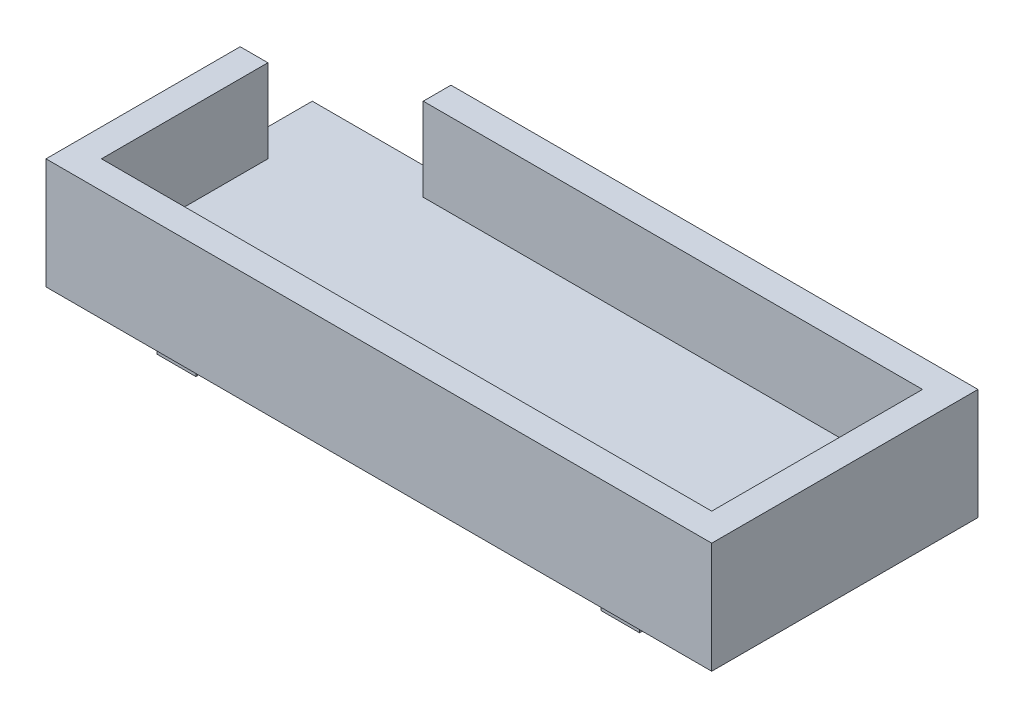
ISO-10303-21;
HEADER;
FILE_DESCRIPTION(('STEP AP214'),'2;1');
FILE_NAME('part.step','',(''),(''),'','','');
FILE_SCHEMA(('AUTOMOTIVE_DESIGN { 1 0 10303 214 1 1 1 1 }'));
ENDSEC;
DATA;
#1=APPLICATION_CONTEXT('core data for automotive mechanical design processes');
#2=APPLICATION_PROTOCOL_DEFINITION('international standard','automotive_design',2000,#1);
#3=PRODUCT_CONTEXT('',#1,'mechanical');
#4=PRODUCT('Part','Part','',(#3));
#5=PRODUCT_RELATED_PRODUCT_CATEGORY('part','',(#4));
#6=PRODUCT_DEFINITION_FORMATION('','',#4);
#7=PRODUCT_DEFINITION_CONTEXT('part definition',#1,'design');
#8=PRODUCT_DEFINITION('design','',#6,#7);
#9=PRODUCT_DEFINITION_SHAPE('','',#8);
#10=(LENGTH_UNIT() NAMED_UNIT(*) SI_UNIT(.MILLI.,.METRE.));
#11=(NAMED_UNIT(*) PLANE_ANGLE_UNIT() SI_UNIT($,.RADIAN.));
#12=(NAMED_UNIT(*) SI_UNIT($,.STERADIAN.) SOLID_ANGLE_UNIT());
#13=UNCERTAINTY_MEASURE_WITH_UNIT(LENGTH_MEASURE(1.E-05),#10,'distance_accuracy_value','');
#14=(GEOMETRIC_REPRESENTATION_CONTEXT(3) GLOBAL_UNCERTAINTY_ASSIGNED_CONTEXT((#13)) GLOBAL_UNIT_ASSIGNED_CONTEXT((#10,
#11,#12)) REPRESENTATION_CONTEXT('',''));
#15=CARTESIAN_POINT('',(0.,0.,0.));
#16=DIRECTION('',(0.,0.,1.));
#17=DIRECTION('',(1.,0.,0.));
#18=AXIS2_PLACEMENT_3D('',#15,#16,#17);
#19=CARTESIAN_POINT('',(0.,0.,0.));
#20=DIRECTION('',(0.,-1.,0.));
#21=DIRECTION('',(0.,0.,-1.));
#22=AXIS2_PLACEMENT_3D('',#19,#20,#21);
#23=PLANE('',#22);
#24=DIRECTION('',(1.,0.,0.));
#25=VECTOR('',#24,1.);
#26=CARTESIAN_POINT('',(0.,0.,-3.49999999999993));
#27=LINE('',#26,#25);
#28=CARTESIAN_POINT('',(16.5,0.,-3.49999999999995));
#29=VERTEX_POINT('',#28);
#30=CARTESIAN_POINT('',(23.5,0.,-3.49999999999996));
#31=VERTEX_POINT('',#30);
#32=EDGE_CURVE('E268',#29,#31,#27,.T.);
#33=ORIENTED_EDGE('',*,*,#32,.T.);
#34=DIRECTION('',(0.,0.,-1.));
#35=VECTOR('',#34,1.);
#36=CARTESIAN_POINT('',(23.5,0.,0.));
#37=LINE('',#36,#35);
#38=CARTESIAN_POINT('',(23.5,0.,-6.99999999999996));
#39=VERTEX_POINT('',#38);
#40=EDGE_CURVE('E284',#31,#39,#37,.T.);
#41=ORIENTED_EDGE('',*,*,#40,.T.);
#42=DIRECTION('',(1.,0.,0.));
#43=VECTOR('',#42,1.);
#44=CARTESIAN_POINT('',(0.,0.,-6.99999999999993));
#45=LINE('',#44,#43);
#46=CARTESIAN_POINT('',(16.5,0.,-6.99999999999995));
#47=VERTEX_POINT('',#46);
#48=EDGE_CURVE('E57',#47,#39,#45,.T.);
#49=ORIENTED_EDGE('',*,*,#48,.F.);
#50=DIRECTION('',(0.,0.,-1.));
#51=VECTOR('',#50,1.);
#52=CARTESIAN_POINT('',(16.5,0.,0.));
#53=LINE('',#52,#51);
#54=EDGE_CURVE('E52',#29,#47,#53,.T.);
#55=ORIENTED_EDGE('',*,*,#54,.F.);
#56=EDGE_LOOP('',(#33,#41,#49,#55));
#57=FACE_BOUND('',#56,.T.);
#58=DIRECTION('',(1.,0.,0.));
#59=VECTOR('',#58,1.);
#60=CARTESIAN_POINT('',(0.,0.,-11.4999999999999));
#61=LINE('',#60,#59);
#62=CARTESIAN_POINT('',(16.5,0.,-11.4999999999999));
#63=VERTEX_POINT('',#62);
#64=CARTESIAN_POINT('',(23.5,0.,-11.5));
#65=VERTEX_POINT('',#64);
#66=EDGE_CURVE('E270',#63,#65,#61,.T.);
#67=ORIENTED_EDGE('',*,*,#66,.T.);
#68=DIRECTION('',(0.,0.,-1.));
#69=VECTOR('',#68,1.);
#70=CARTESIAN_POINT('',(23.5,0.,0.));
#71=LINE('',#70,#69);
#72=CARTESIAN_POINT('',(23.5,0.,-15.));
#73=VERTEX_POINT('',#72);
#74=EDGE_CURVE('E303',#65,#73,#71,.T.);
#75=ORIENTED_EDGE('',*,*,#74,.T.);
#76=DIRECTION('',(1.,0.,0.));
#77=VECTOR('',#76,1.);
#78=CARTESIAN_POINT('',(0.,0.,-14.9999999999999));
#79=LINE('',#78,#77);
#80=CARTESIAN_POINT('',(16.5,0.,-14.9999999999999));
#81=VERTEX_POINT('',#80);
#82=EDGE_CURVE('E315',#81,#73,#79,.T.);
#83=ORIENTED_EDGE('',*,*,#82,.F.);
#84=DIRECTION('',(0.,0.,-1.));
#85=VECTOR('',#84,1.);
#86=CARTESIAN_POINT('',(16.5,0.,0.));
#87=LINE('',#86,#85);
#88=EDGE_CURVE('E312',#63,#81,#87,.T.);
#89=ORIENTED_EDGE('',*,*,#88,.F.);
#90=EDGE_LOOP('',(#67,#75,#83,#89));
#91=FACE_BOUND('',#90,.T.);
#92=DIRECTION('',(1.,0.,0.));
#93=VECTOR('',#92,1.);
#94=CARTESIAN_POINT('',(0.,0.,-19.4999999999999));
#95=LINE('',#94,#93);
#96=CARTESIAN_POINT('',(16.4999999999999,0.,-19.5));
#97=VERTEX_POINT('',#96);
#98=CARTESIAN_POINT('',(23.4999999999999,0.,-19.5));
#99=VERTEX_POINT('',#98);
#100=EDGE_CURVE('E330',#97,#99,#95,.T.);
#101=ORIENTED_EDGE('',*,*,#100,.T.);
#102=DIRECTION('',(0.,0.,-1.));
#103=VECTOR('',#102,1.);
#104=CARTESIAN_POINT('',(23.4999999999999,0.,0.));
#105=LINE('',#104,#103);
#106=CARTESIAN_POINT('',(23.4999999999999,0.,-23.));
#107=VERTEX_POINT('',#106);
#108=EDGE_CURVE('E335',#99,#107,#105,.T.);
#109=ORIENTED_EDGE('',*,*,#108,.T.);
#110=DIRECTION('',(1.,0.,0.));
#111=VECTOR('',#110,1.);
#112=CARTESIAN_POINT('',(0.,0.,-22.9999999999999));
#113=LINE('',#112,#111);
#114=CARTESIAN_POINT('',(16.4999999999999,0.,-23.));
#115=VERTEX_POINT('',#114);
#116=EDGE_CURVE('E347',#115,#107,#113,.T.);
#117=ORIENTED_EDGE('',*,*,#116,.F.);
#118=DIRECTION('',(0.,0.,-1.));
#119=VECTOR('',#118,1.);
#120=CARTESIAN_POINT('',(16.4999999999999,0.,0.));
#121=LINE('',#120,#119);
#122=EDGE_CURVE('E344',#97,#115,#121,.T.);
#123=ORIENTED_EDGE('',*,*,#122,.F.);
#124=EDGE_LOOP('',(#101,#109,#117,#123));
#125=FACE_BOUND('',#124,.T.);
#126=DIRECTION('',(-1.,0.,0.));
#127=VECTOR('',#126,1.);
#128=CARTESIAN_POINT('',(0.,0.,-15.));
#129=LINE('',#128,#127);
#130=CARTESIAN_POINT('',(103.5,0.,-15.));
#131=VERTEX_POINT('',#130);
#132=CARTESIAN_POINT('',(96.5,0.,-15.));
#133=VERTEX_POINT('',#132);
#134=EDGE_CURVE('E395',#131,#133,#129,.T.);
#135=ORIENTED_EDGE('',*,*,#134,.T.);
#136=DIRECTION('',(0.,0.,-1.));
#137=VECTOR('',#136,1.);
#138=CARTESIAN_POINT('',(96.5,0.,0.));
#139=LINE('',#138,#137);
#140=CARTESIAN_POINT('',(96.5,0.,-11.5));
#141=VERTEX_POINT('',#140);
#142=EDGE_CURVE('E400',#141,#133,#139,.T.);
#143=ORIENTED_EDGE('',*,*,#142,.F.);
#144=DIRECTION('',(-1.,0.,0.));
#145=VECTOR('',#144,1.);
#146=CARTESIAN_POINT('',(0.,0.,-11.5));
#147=LINE('',#146,#145);
#148=CARTESIAN_POINT('',(103.5,0.,-11.5));
#149=VERTEX_POINT('',#148);
#150=EDGE_CURVE('E413',#149,#141,#147,.T.);
#151=ORIENTED_EDGE('',*,*,#150,.F.);
#152=DIRECTION('',(0.,0.,-1.));
#153=VECTOR('',#152,1.);
#154=CARTESIAN_POINT('',(103.5,0.,0.));
#155=LINE('',#154,#153);
#156=EDGE_CURVE('E410',#149,#131,#155,.T.);
#157=ORIENTED_EDGE('',*,*,#156,.T.);
#158=EDGE_LOOP('',(#135,#143,#151,#157));
#159=FACE_BOUND('',#158,.T.);
#160=DIRECTION('',(-1.,0.,0.));
#161=VECTOR('',#160,1.);
#162=CARTESIAN_POINT('',(0.,0.,-23.));
#163=LINE('',#162,#161);
#164=CARTESIAN_POINT('',(103.5,0.,-23.));
#165=VERTEX_POINT('',#164);
#166=CARTESIAN_POINT('',(96.5,0.,-23.));
#167=VERTEX_POINT('',#166);
#168=EDGE_CURVE('E425',#165,#167,#163,.T.);
#169=ORIENTED_EDGE('',*,*,#168,.T.);
#170=DIRECTION('',(0.,0.,-1.));
#171=VECTOR('',#170,1.);
#172=CARTESIAN_POINT('',(96.5,0.,0.));
#173=LINE('',#172,#171);
#174=CARTESIAN_POINT('',(96.5,0.,-19.5));
#175=VERTEX_POINT('',#174);
#176=EDGE_CURVE('E430',#175,#167,#173,.T.);
#177=ORIENTED_EDGE('',*,*,#176,.F.);
#178=DIRECTION('',(-1.,0.,0.));
#179=VECTOR('',#178,1.);
#180=CARTESIAN_POINT('',(0.,0.,-19.5));
#181=LINE('',#180,#179);
#182=CARTESIAN_POINT('',(103.5,0.,-19.5));
#183=VERTEX_POINT('',#182);
#184=EDGE_CURVE('E443',#183,#175,#181,.T.);
#185=ORIENTED_EDGE('',*,*,#184,.F.);
#186=DIRECTION('',(0.,0.,-1.));
#187=VECTOR('',#186,1.);
#188=CARTESIAN_POINT('',(103.5,0.,0.));
#189=LINE('',#188,#187);
#190=EDGE_CURVE('E440',#183,#165,#189,.T.);
#191=ORIENTED_EDGE('',*,*,#190,.T.);
#192=EDGE_LOOP('',(#169,#177,#185,#191));
#193=FACE_BOUND('',#192,.T.);
#194=DIRECTION('',(0.,0.,-1.));
#195=VECTOR('',#194,1.);
#196=CARTESIAN_POINT('',(0.,0.,0.));
#197=LINE('',#196,#195);
#198=CARTESIAN_POINT('',(0.,0.,0.));
#199=VERTEX_POINT('',#198);
#200=CARTESIAN_POINT('',(0.,0.,-48.));
#201=VERTEX_POINT('',#200);
#202=EDGE_CURVE('E517',#199,#201,#197,.T.);
#203=ORIENTED_EDGE('',*,*,#202,.T.);
#204=DIRECTION('',(1.,0.,0.));
#205=VECTOR('',#204,1.);
#206=CARTESIAN_POINT('',(0.,0.,-48.));
#207=LINE('',#206,#205);
#208=CARTESIAN_POINT('',(120.,0.,-48.));
#209=VERTEX_POINT('',#208);
#210=EDGE_CURVE('E526',#201,#209,#207,.T.);
#211=ORIENTED_EDGE('',*,*,#210,.T.);
#212=DIRECTION('',(0.,0.,-1.));
#213=VECTOR('',#212,1.);
#214=CARTESIAN_POINT('',(120.,0.,0.));
#215=LINE('',#214,#213);
#216=CARTESIAN_POINT('',(120.,0.,0.));
#217=VERTEX_POINT('',#216);
#218=EDGE_CURVE('E529',#217,#209,#215,.T.);
#219=ORIENTED_EDGE('',*,*,#218,.F.);
#220=DIRECTION('',(1.,0.,0.));
#221=VECTOR('',#220,1.);
#222=CARTESIAN_POINT('',(0.,0.,0.));
#223=LINE('',#222,#221);
#224=EDGE_CURVE('E521',#199,#217,#223,.T.);
#225=ORIENTED_EDGE('',*,*,#224,.F.);
#226=EDGE_LOOP('',(#203,#211,#219,#225));
#227=FACE_BOUND('',#226,.T.);
#228=DIRECTION('',(0.,0.,-1.));
#229=VECTOR('',#228,1.);
#230=CARTESIAN_POINT('',(96.5,0.,0.));
#231=LINE('',#230,#229);
#232=CARTESIAN_POINT('',(96.5,0.,-3.5));
#233=VERTEX_POINT('',#232);
#234=CARTESIAN_POINT('',(96.5,0.,-7.));
#235=VERTEX_POINT('',#234);
#236=EDGE_CURVE('E378',#233,#235,#231,.T.);
#237=ORIENTED_EDGE('',*,*,#236,.F.);
#238=DIRECTION('',(-1.,0.,0.));
#239=VECTOR('',#238,1.);
#240=CARTESIAN_POINT('',(0.,0.,-3.5));
#241=LINE('',#240,#239);
#242=CARTESIAN_POINT('',(103.5,0.,-3.5));
#243=VERTEX_POINT('',#242);
#244=EDGE_CURVE('E362',#243,#233,#241,.T.);
#245=ORIENTED_EDGE('',*,*,#244,.F.);
#246=DIRECTION('',(0.,0.,-1.));
#247=VECTOR('',#246,1.);
#248=CARTESIAN_POINT('',(103.5,0.,0.));
#249=LINE('',#248,#247);
#250=CARTESIAN_POINT('',(103.5,0.,-7.));
#251=VERTEX_POINT('',#250);
#252=EDGE_CURVE('E367',#243,#251,#249,.T.);
#253=ORIENTED_EDGE('',*,*,#252,.T.);
#254=DIRECTION('',(-1.,0.,0.));
#255=VECTOR('',#254,1.);
#256=CARTESIAN_POINT('',(0.,0.,-7.));
#257=LINE('',#256,#255);
#258=EDGE_CURVE('E381',#251,#235,#257,.T.);
#259=ORIENTED_EDGE('',*,*,#258,.T.);
#260=EDGE_LOOP('',(#237,#245,#253,#259));
#261=FACE_BOUND('',#260,.T.);
#262=ADVANCED_FACE('F35',(#57,#91,#125,#159,#193,#227,#261),#23,.T.);
#263=CARTESIAN_POINT('',(0.,5.,0.));
#264=DIRECTION('',(0.,-1.,0.));
#265=DIRECTION('',(0.,0.,-1.));
#266=AXIS2_PLACEMENT_3D('',#263,#264,#265);
#267=PLANE('',#266);
#268=DIRECTION('',(-1.,0.,0.));
#269=VECTOR('',#268,1.);
#270=CARTESIAN_POINT('',(5.,5.,-35.));
#271=LINE('',#270,#269);
#272=CARTESIAN_POINT('',(5.,5.,-35.));
#273=VERTEX_POINT('',#272);
#274=CARTESIAN_POINT('',(0.,5.,-35.));
#275=VERTEX_POINT('',#274);
#276=EDGE_CURVE('E460',#273,#275,#271,.T.);
#277=ORIENTED_EDGE('',*,*,#276,.F.);
#278=DIRECTION('',(0.,0.,-1.));
#279=VECTOR('',#278,1.);
#280=CARTESIAN_POINT('',(5.,5.,-4.99999999999999));
#281=LINE('',#280,#279);
#282=CARTESIAN_POINT('',(5.,5.,-4.99999999999999));
#283=VERTEX_POINT('',#282);
#284=EDGE_CURVE('E492',#283,#273,#281,.T.);
#285=ORIENTED_EDGE('',*,*,#284,.F.);
#286=DIRECTION('',(-1.,0.,0.));
#287=VECTOR('',#286,1.);
#288=CARTESIAN_POINT('',(115.,5.,-5.));
#289=LINE('',#288,#287);
#290=CARTESIAN_POINT('',(115.,5.,-5.));
#291=VERTEX_POINT('',#290);
#292=EDGE_CURVE('E489',#291,#283,#289,.T.);
#293=ORIENTED_EDGE('',*,*,#292,.F.);
#294=DIRECTION('',(0.,0.,1.));
#295=VECTOR('',#294,1.);
#296=CARTESIAN_POINT('',(115.,5.,-43.));
#297=LINE('',#296,#295);
#298=CARTESIAN_POINT('',(115.,5.,-43.));
#299=VERTEX_POINT('',#298);
#300=EDGE_CURVE('E486',#299,#291,#297,.T.);
#301=ORIENTED_EDGE('',*,*,#300,.F.);
#302=DIRECTION('',(1.,0.,0.));
#303=VECTOR('',#302,1.);
#304=CARTESIAN_POINT('',(25.,5.,-43.));
#305=LINE('',#304,#303);
#306=CARTESIAN_POINT('',(25.,5.,-43.));
#307=VERTEX_POINT('',#306);
#308=EDGE_CURVE('E483',#307,#299,#305,.T.);
#309=ORIENTED_EDGE('',*,*,#308,.F.);
#310=DIRECTION('',(0.,0.,1.));
#311=VECTOR('',#310,1.);
#312=CARTESIAN_POINT('',(25.,5.,-48.));
#313=LINE('',#312,#311);
#314=CARTESIAN_POINT('',(25.,5.,-48.));
#315=VERTEX_POINT('',#314);
#316=EDGE_CURVE('E455',#315,#307,#313,.T.);
#317=ORIENTED_EDGE('',*,*,#316,.F.);
#318=DIRECTION('',(1.,0.,0.));
#319=VECTOR('',#318,1.);
#320=CARTESIAN_POINT('',(0.,5.,-48.));
#321=LINE('',#320,#319);
#322=CARTESIAN_POINT('',(0.,5.,-48.));
#323=VERTEX_POINT('',#322);
#324=EDGE_CURVE('E520',#323,#315,#321,.T.);
#325=ORIENTED_EDGE('',*,*,#324,.F.);
#326=DIRECTION('',(0.,0.,-1.));
#327=VECTOR('',#326,1.);
#328=CARTESIAN_POINT('',(0.,5.,0.));
#329=LINE('',#328,#327);
#330=EDGE_CURVE('E518',#275,#323,#329,.T.);
#331=ORIENTED_EDGE('',*,*,#330,.F.);
#332=EDGE_LOOP('',(#277,#285,#293,#301,#309,#317,#325,#331));
#333=FACE_BOUND('',#332,.T.);
#334=ADVANCED_FACE('F563',(#333),#267,.F.);
#335=CARTESIAN_POINT('',(0.,5.,0.));
#336=DIRECTION('',(-1.,0.,0.));
#337=DIRECTION('',(0.,0.,1.));
#338=AXIS2_PLACEMENT_3D('',#335,#336,#337);
#339=PLANE('',#338);
#340=ORIENTED_EDGE('',*,*,#202,.F.);
#341=DIRECTION('',(0.,-1.,0.));
#342=VECTOR('',#341,1.);
#343=CARTESIAN_POINT('',(0.,5.,0.));
#344=LINE('',#343,#342);
#345=CARTESIAN_POINT('',(0.,20.,0.));
#346=VERTEX_POINT('',#345);
#347=EDGE_CURVE('E11',#346,#199,#344,.T.);
#348=ORIENTED_EDGE('',*,*,#347,.F.);
#349=DIRECTION('',(0.,0.,1.));
#350=VECTOR('',#349,1.);
#351=CARTESIAN_POINT('',(0.,20.,-35.));
#352=LINE('',#351,#350);
#353=CARTESIAN_POINT('',(0.,20.,-35.));
#354=VERTEX_POINT('',#353);
#355=EDGE_CURVE('E474',#354,#346,#352,.T.);
#356=ORIENTED_EDGE('',*,*,#355,.F.);
#357=DIRECTION('',(0.,-1.,0.));
#358=VECTOR('',#357,1.);
#359=CARTESIAN_POINT('',(0.,20.,-35.));
#360=LINE('',#359,#358);
#361=EDGE_CURVE('E480',#354,#275,#360,.T.);
#362=ORIENTED_EDGE('',*,*,#361,.T.);
#363=ORIENTED_EDGE('',*,*,#330,.T.);
#364=DIRECTION('',(0.,-1.,0.));
#365=VECTOR('',#364,1.);
#366=CARTESIAN_POINT('',(0.,5.,-48.));
#367=LINE('',#366,#365);
#368=EDGE_CURVE('E39',#323,#201,#367,.T.);
#369=ORIENTED_EDGE('',*,*,#368,.T.);
#370=EDGE_LOOP('',(#340,#348,#356,#362,#363,#369));
#371=FACE_BOUND('',#370,.T.);
#372=ADVANCED_FACE('F37',(#371),#339,.T.);
#373=CARTESIAN_POINT('',(0.,5.,0.));
#374=DIRECTION('',(0.,0.,-1.));
#375=DIRECTION('',(-1.,0.,0.));
#376=AXIS2_PLACEMENT_3D('',#373,#374,#375);
#377=PLANE('',#376);
#378=ORIENTED_EDGE('',*,*,#224,.T.);
#379=DIRECTION('',(0.,-1.,0.));
#380=VECTOR('',#379,1.);
#381=CARTESIAN_POINT('',(120.,5.,0.));
#382=LINE('',#381,#380);
#383=CARTESIAN_POINT('',(120.,20.,0.));
#384=VERTEX_POINT('',#383);
#385=EDGE_CURVE('E44',#384,#217,#382,.T.);
#386=ORIENTED_EDGE('',*,*,#385,.F.);
#387=DIRECTION('',(1.,0.,0.));
#388=VECTOR('',#387,1.);
#389=CARTESIAN_POINT('',(0.,20.,0.));
#390=LINE('',#389,#388);
#391=EDGE_CURVE('E477',#346,#384,#390,.T.);
#392=ORIENTED_EDGE('',*,*,#391,.F.);
#393=ORIENTED_EDGE('',*,*,#347,.T.);
#394=EDGE_LOOP('',(#378,#386,#392,#393));
#395=FACE_BOUND('',#394,.T.);
#396=ADVANCED_FACE('F548',(#395),#377,.F.);
#397=CARTESIAN_POINT('',(120.,5.,0.));
#398=DIRECTION('',(-1.,0.,0.));
#399=DIRECTION('',(0.,0.,1.));
#400=AXIS2_PLACEMENT_3D('',#397,#398,#399);
#401=PLANE('',#400);
#402=ORIENTED_EDGE('',*,*,#218,.T.);
#403=DIRECTION('',(0.,-1.,0.));
#404=VECTOR('',#403,1.);
#405=CARTESIAN_POINT('',(120.,5.,-48.));
#406=LINE('',#405,#404);
#407=CARTESIAN_POINT('',(120.,20.,-48.));
#408=VERTEX_POINT('',#407);
#409=EDGE_CURVE('E534',#408,#209,#406,.T.);
#410=ORIENTED_EDGE('',*,*,#409,.F.);
#411=DIRECTION('',(0.,0.,-1.));
#412=VECTOR('',#411,1.);
#413=CARTESIAN_POINT('',(120.,20.,0.));
#414=LINE('',#413,#412);
#415=EDGE_CURVE('E456',#384,#408,#414,.T.);
#416=ORIENTED_EDGE('',*,*,#415,.F.);
#417=ORIENTED_EDGE('',*,*,#385,.T.);
#418=EDGE_LOOP('',(#402,#410,#416,#417));
#419=FACE_BOUND('',#418,.T.);
#420=ADVANCED_FACE('F552',(#419),#401,.F.);
#421=CARTESIAN_POINT('',(0.,5.,-48.));
#422=DIRECTION('',(0.,0.,-1.));
#423=DIRECTION('',(-1.,0.,0.));
#424=AXIS2_PLACEMENT_3D('',#421,#422,#423);
#425=PLANE('',#424);
#426=ORIENTED_EDGE('',*,*,#210,.F.);
#427=ORIENTED_EDGE('',*,*,#368,.F.);
#428=ORIENTED_EDGE('',*,*,#324,.T.);
#429=DIRECTION('',(0.,-1.,0.));
#430=VECTOR('',#429,1.);
#431=CARTESIAN_POINT('',(25.,20.,-48.));
#432=LINE('',#431,#430);
#433=CARTESIAN_POINT('',(25.,20.,-48.));
#434=VERTEX_POINT('',#433);
#435=EDGE_CURVE('E514',#434,#315,#432,.T.);
#436=ORIENTED_EDGE('',*,*,#435,.F.);
#437=DIRECTION('',(-1.,0.,0.));
#438=VECTOR('',#437,1.);
#439=CARTESIAN_POINT('',(120.,20.,-48.));
#440=LINE('',#439,#438);
#441=EDGE_CURVE('E459',#408,#434,#440,.T.);
#442=ORIENTED_EDGE('',*,*,#441,.F.);
#443=ORIENTED_EDGE('',*,*,#409,.T.);
#444=EDGE_LOOP('',(#426,#427,#428,#436,#442,#443));
#445=FACE_BOUND('',#444,.T.);
#446=ADVANCED_FACE('F542',(#445),#425,.T.);
#447=CARTESIAN_POINT('',(25.,20.,-48.));
#448=DIRECTION('',(1.,0.,0.));
#449=DIRECTION('',(0.,0.,-1.));
#450=AXIS2_PLACEMENT_3D('',#447,#448,#449);
#451=PLANE('',#450);
#452=ORIENTED_EDGE('',*,*,#316,.T.);
#453=DIRECTION('',(0.,-1.,0.));
#454=VECTOR('',#453,1.);
#455=CARTESIAN_POINT('',(25.,20.,-43.));
#456=LINE('',#455,#454);
#457=CARTESIAN_POINT('',(25.,20.,-43.));
#458=VERTEX_POINT('',#457);
#459=EDGE_CURVE('E511',#458,#307,#456,.T.);
#460=ORIENTED_EDGE('',*,*,#459,.F.);
#461=DIRECTION('',(0.,0.,1.));
#462=VECTOR('',#461,1.);
#463=CARTESIAN_POINT('',(25.,20.,-48.));
#464=LINE('',#463,#462);
#465=EDGE_CURVE('E462',#434,#458,#464,.T.);
#466=ORIENTED_EDGE('',*,*,#465,.F.);
#467=ORIENTED_EDGE('',*,*,#435,.T.);
#468=EDGE_LOOP('',(#452,#460,#466,#467));
#469=FACE_BOUND('',#468,.T.);
#470=ADVANCED_FACE('F581',(#469),#451,.F.);
#471=CARTESIAN_POINT('',(25.,20.,-43.));
#472=DIRECTION('',(0.,0.,-1.));
#473=DIRECTION('',(-1.,0.,0.));
#474=AXIS2_PLACEMENT_3D('',#471,#472,#473);
#475=PLANE('',#474);
#476=ORIENTED_EDGE('',*,*,#308,.T.);
#477=DIRECTION('',(0.,-1.,0.));
#478=VECTOR('',#477,1.);
#479=CARTESIAN_POINT('',(115.,20.,-43.));
#480=LINE('',#479,#478);
#481=CARTESIAN_POINT('',(115.,20.,-43.));
#482=VERTEX_POINT('',#481);
#483=EDGE_CURVE('E508',#482,#299,#480,.T.);
#484=ORIENTED_EDGE('',*,*,#483,.F.);
#485=DIRECTION('',(1.,0.,0.));
#486=VECTOR('',#485,1.);
#487=CARTESIAN_POINT('',(25.,20.,-43.));
#488=LINE('',#487,#486);
#489=EDGE_CURVE('E464',#458,#482,#488,.T.);
#490=ORIENTED_EDGE('',*,*,#489,.F.);
#491=ORIENTED_EDGE('',*,*,#459,.T.);
#492=EDGE_LOOP('',(#476,#484,#490,#491));
#493=FACE_BOUND('',#492,.T.);
#494=ADVANCED_FACE('F578',(#493),#475,.F.);
#495=CARTESIAN_POINT('',(115.,20.,-43.));
#496=DIRECTION('',(1.,0.,0.));
#497=DIRECTION('',(0.,0.,-1.));
#498=AXIS2_PLACEMENT_3D('',#495,#496,#497);
#499=PLANE('',#498);
#500=ORIENTED_EDGE('',*,*,#300,.T.);
#501=DIRECTION('',(0.,-1.,0.));
#502=VECTOR('',#501,1.);
#503=CARTESIAN_POINT('',(115.,20.,-5.));
#504=LINE('',#503,#502);
#505=CARTESIAN_POINT('',(115.,20.,-5.));
#506=VERTEX_POINT('',#505);
#507=EDGE_CURVE('E505',#506,#291,#504,.T.);
#508=ORIENTED_EDGE('',*,*,#507,.F.);
#509=DIRECTION('',(0.,0.,1.));
#510=VECTOR('',#509,1.);
#511=CARTESIAN_POINT('',(115.,20.,-43.));
#512=LINE('',#511,#510);
#513=EDGE_CURVE('E466',#482,#506,#512,.T.);
#514=ORIENTED_EDGE('',*,*,#513,.F.);
#515=ORIENTED_EDGE('',*,*,#483,.T.);
#516=EDGE_LOOP('',(#500,#508,#514,#515));
#517=FACE_BOUND('',#516,.T.);
#518=ADVANCED_FACE('F573',(#517),#499,.F.);
#519=CARTESIAN_POINT('',(115.,20.,-5.));
#520=DIRECTION('',(0.,0.,1.));
#521=DIRECTION('',(1.,0.,0.));
#522=AXIS2_PLACEMENT_3D('',#519,#520,#521);
#523=PLANE('',#522);
#524=ORIENTED_EDGE('',*,*,#292,.T.);
#525=DIRECTION('',(0.,-1.,0.));
#526=VECTOR('',#525,1.);
#527=CARTESIAN_POINT('',(5.,20.,-4.99999999999999));
#528=LINE('',#527,#526);
#529=CARTESIAN_POINT('',(5.,20.,-4.99999999999999));
#530=VERTEX_POINT('',#529);
#531=EDGE_CURVE('E502',#530,#283,#528,.T.);
#532=ORIENTED_EDGE('',*,*,#531,.F.);
#533=DIRECTION('',(-1.,0.,0.));
#534=VECTOR('',#533,1.);
#535=CARTESIAN_POINT('',(115.,20.,-5.));
#536=LINE('',#535,#534);
#537=EDGE_CURVE('E468',#506,#530,#536,.T.);
#538=ORIENTED_EDGE('',*,*,#537,.F.);
#539=ORIENTED_EDGE('',*,*,#507,.T.);
#540=EDGE_LOOP('',(#524,#532,#538,#539));
#541=FACE_BOUND('',#540,.T.);
#542=ADVANCED_FACE('F570',(#541),#523,.F.);
#543=CARTESIAN_POINT('',(5.,20.,-4.99999999999999));
#544=DIRECTION('',(-1.,0.,0.));
#545=DIRECTION('',(0.,0.,1.));
#546=AXIS2_PLACEMENT_3D('',#543,#544,#545);
#547=PLANE('',#546);
#548=ORIENTED_EDGE('',*,*,#284,.T.);
#549=DIRECTION('',(0.,-1.,0.));
#550=VECTOR('',#549,1.);
#551=CARTESIAN_POINT('',(5.,20.,-35.));
#552=LINE('',#551,#550);
#553=CARTESIAN_POINT('',(5.,20.,-35.));
#554=VERTEX_POINT('',#553);
#555=EDGE_CURVE('E499',#554,#273,#552,.T.);
#556=ORIENTED_EDGE('',*,*,#555,.F.);
#557=DIRECTION('',(0.,0.,-1.));
#558=VECTOR('',#557,1.);
#559=CARTESIAN_POINT('',(5.,20.,-4.99999999999999));
#560=LINE('',#559,#558);
#561=EDGE_CURVE('E470',#530,#554,#560,.T.);
#562=ORIENTED_EDGE('',*,*,#561,.F.);
#563=ORIENTED_EDGE('',*,*,#531,.T.);
#564=EDGE_LOOP('',(#548,#556,#562,#563));
#565=FACE_BOUND('',#564,.T.);
#566=ADVANCED_FACE('F565',(#565),#547,.F.);
#567=CARTESIAN_POINT('',(5.,20.,-35.));
#568=DIRECTION('',(0.,0.,1.));
#569=DIRECTION('',(1.,0.,0.));
#570=AXIS2_PLACEMENT_3D('',#567,#568,#569);
#571=PLANE('',#570);
#572=ORIENTED_EDGE('',*,*,#276,.T.);
#573=ORIENTED_EDGE('',*,*,#361,.F.);
#574=DIRECTION('',(-1.,0.,0.));
#575=VECTOR('',#574,1.);
#576=CARTESIAN_POINT('',(5.,20.,-35.));
#577=LINE('',#576,#575);
#578=EDGE_CURVE('E472',#554,#354,#577,.T.);
#579=ORIENTED_EDGE('',*,*,#578,.F.);
#580=ORIENTED_EDGE('',*,*,#555,.T.);
#581=EDGE_LOOP('',(#572,#573,#579,#580));
#582=FACE_BOUND('',#581,.T.);
#583=ADVANCED_FACE('F560',(#582),#571,.F.);
#584=CARTESIAN_POINT('',(0.,20.,0.));
#585=DIRECTION('',(0.,1.,0.));
#586=DIRECTION('',(0.,0.,1.));
#587=AXIS2_PLACEMENT_3D('',#584,#585,#586);
#588=PLANE('',#587);
#589=ORIENTED_EDGE('',*,*,#415,.T.);
#590=ORIENTED_EDGE('',*,*,#441,.T.);
#591=ORIENTED_EDGE('',*,*,#465,.T.);
#592=ORIENTED_EDGE('',*,*,#489,.T.);
#593=ORIENTED_EDGE('',*,*,#513,.T.);
#594=ORIENTED_EDGE('',*,*,#537,.T.);
#595=ORIENTED_EDGE('',*,*,#561,.T.);
#596=ORIENTED_EDGE('',*,*,#578,.T.);
#597=ORIENTED_EDGE('',*,*,#355,.T.);
#598=ORIENTED_EDGE('',*,*,#391,.T.);
#599=EDGE_LOOP('',(#589,#590,#591,#592,#593,#594,#595,#596,#597,#598));
#600=FACE_BOUND('',#599,.T.);
#601=ADVANCED_FACE('F554',(#600),#588,.T.);
#602=CARTESIAN_POINT('',(0.,-4.,-23.));
#603=DIRECTION('',(0.,0.,-1.));
#604=DIRECTION('',(-1.,0.,0.));
#605=AXIS2_PLACEMENT_3D('',#602,#603,#604);
#606=PLANE('',#605);
#607=ORIENTED_EDGE('',*,*,#168,.F.);
#608=DIRECTION('',(0.,1.,0.));
#609=VECTOR('',#608,1.);
#610=CARTESIAN_POINT('',(103.5,-4.,-23.));
#611=LINE('',#610,#609);
#612=CARTESIAN_POINT('',(103.5,-4.,-23.));
#613=VERTEX_POINT('',#612);
#614=EDGE_CURVE('E453',#613,#165,#611,.T.);
#615=ORIENTED_EDGE('',*,*,#614,.F.);
#616=DIRECTION('',(-1.,0.,0.));
#617=VECTOR('',#616,1.);
#618=CARTESIAN_POINT('',(0.,-4.,-23.));
#619=LINE('',#618,#617);
#620=CARTESIAN_POINT('',(96.5,-4.,-23.));
#621=VERTEX_POINT('',#620);
#622=EDGE_CURVE('E426',#613,#621,#619,.T.);
#623=ORIENTED_EDGE('',*,*,#622,.T.);
#624=DIRECTION('',(0.,1.,0.));
#625=VECTOR('',#624,1.);
#626=CARTESIAN_POINT('',(96.5,-4.,-23.));
#627=LINE('',#626,#625);
#628=EDGE_CURVE('E437',#621,#167,#627,.T.);
#629=ORIENTED_EDGE('',*,*,#628,.T.);
#630=EDGE_LOOP('',(#607,#615,#623,#629));
#631=FACE_BOUND('',#630,.T.);
#632=ADVANCED_FACE('F661',(#631),#606,.T.);
#633=CARTESIAN_POINT('',(103.5,-4.,0.));
#634=DIRECTION('',(1.,0.,0.));
#635=DIRECTION('',(0.,0.,-1.));
#636=AXIS2_PLACEMENT_3D('',#633,#634,#635);
#637=PLANE('',#636);
#638=ORIENTED_EDGE('',*,*,#190,.F.);
#639=DIRECTION('',(0.,1.,0.));
#640=VECTOR('',#639,1.);
#641=CARTESIAN_POINT('',(103.5,-4.,-19.5));
#642=LINE('',#641,#640);
#643=CARTESIAN_POINT('',(103.5,-4.,-19.5));
#644=VERTEX_POINT('',#643);
#645=EDGE_CURVE('E451',#644,#183,#642,.T.);
#646=ORIENTED_EDGE('',*,*,#645,.F.);
#647=DIRECTION('',(0.,0.,-1.));
#648=VECTOR('',#647,1.);
#649=CARTESIAN_POINT('',(103.5,-4.,0.));
#650=LINE('',#649,#648);
#651=EDGE_CURVE('E429',#644,#613,#650,.T.);
#652=ORIENTED_EDGE('',*,*,#651,.T.);
#653=ORIENTED_EDGE('',*,*,#614,.T.);
#654=EDGE_LOOP('',(#638,#646,#652,#653));
#655=FACE_BOUND('',#654,.T.);
#656=ADVANCED_FACE('F675',(#655),#637,.T.);
#657=CARTESIAN_POINT('',(0.,-4.,-19.5));
#658=DIRECTION('',(0.,0.,-1.));
#659=DIRECTION('',(-1.,0.,0.));
#660=AXIS2_PLACEMENT_3D('',#657,#658,#659);
#661=PLANE('',#660);
#662=ORIENTED_EDGE('',*,*,#184,.T.);
#663=DIRECTION('',(0.,1.,0.));
#664=VECTOR('',#663,1.);
#665=CARTESIAN_POINT('',(96.5,-4.,-19.5));
#666=LINE('',#665,#664);
#667=CARTESIAN_POINT('',(96.5,-4.,-19.5));
#668=VERTEX_POINT('',#667);
#669=EDGE_CURVE('E449',#668,#175,#666,.T.);
#670=ORIENTED_EDGE('',*,*,#669,.F.);
#671=DIRECTION('',(-1.,0.,0.));
#672=VECTOR('',#671,1.);
#673=CARTESIAN_POINT('',(0.,-4.,-19.5));
#674=LINE('',#673,#672);
#675=EDGE_CURVE('E433',#644,#668,#674,.T.);
#676=ORIENTED_EDGE('',*,*,#675,.F.);
#677=ORIENTED_EDGE('',*,*,#645,.T.);
#678=EDGE_LOOP('',(#662,#670,#676,#677));
#679=FACE_BOUND('',#678,.T.);
#680=ADVANCED_FACE('F685',(#679),#661,.F.);
#681=CARTESIAN_POINT('',(96.5,-4.,0.));
#682=DIRECTION('',(1.,0.,0.));
#683=DIRECTION('',(0.,0.,-1.));
#684=AXIS2_PLACEMENT_3D('',#681,#682,#683);
#685=PLANE('',#684);
#686=ORIENTED_EDGE('',*,*,#176,.T.);
#687=ORIENTED_EDGE('',*,*,#628,.F.);
#688=DIRECTION('',(0.,0.,-1.));
#689=VECTOR('',#688,1.);
#690=CARTESIAN_POINT('',(96.5,-4.,0.));
#691=LINE('',#690,#689);
#692=EDGE_CURVE('E435',#668,#621,#691,.T.);
#693=ORIENTED_EDGE('',*,*,#692,.F.);
#694=ORIENTED_EDGE('',*,*,#669,.T.);
#695=EDGE_LOOP('',(#686,#687,#693,#694));
#696=FACE_BOUND('',#695,.T.);
#697=ADVANCED_FACE('F695',(#696),#685,.F.);
#698=CARTESIAN_POINT('',(0.,-4.,0.));
#699=DIRECTION('',(0.,-1.,0.));
#700=DIRECTION('',(0.,0.,-1.));
#701=AXIS2_PLACEMENT_3D('',#698,#699,#700);
#702=PLANE('',#701);
#703=ORIENTED_EDGE('',*,*,#622,.F.);
#704=ORIENTED_EDGE('',*,*,#651,.F.);
#705=ORIENTED_EDGE('',*,*,#675,.T.);
#706=ORIENTED_EDGE('',*,*,#692,.T.);
#707=EDGE_LOOP('',(#703,#704,#705,#706));
#708=FACE_BOUND('',#707,.T.);
#709=ADVANCED_FACE('F705',(#708),#702,.T.);
#710=CARTESIAN_POINT('',(0.,-4.,-15.));
#711=DIRECTION('',(0.,0.,-1.));
#712=DIRECTION('',(-1.,0.,0.));
#713=AXIS2_PLACEMENT_3D('',#710,#711,#712);
#714=PLANE('',#713);
#715=ORIENTED_EDGE('',*,*,#134,.F.);
#716=DIRECTION('',(0.,1.,0.));
#717=VECTOR('',#716,1.);
#718=CARTESIAN_POINT('',(103.5,-4.,-15.));
#719=LINE('',#718,#717);
#720=CARTESIAN_POINT('',(103.5,-4.,-15.));
#721=VERTEX_POINT('',#720);
#722=EDGE_CURVE('E423',#721,#131,#719,.T.);
#723=ORIENTED_EDGE('',*,*,#722,.F.);
#724=DIRECTION('',(-1.,0.,0.));
#725=VECTOR('',#724,1.);
#726=CARTESIAN_POINT('',(0.,-4.,-15.));
#727=LINE('',#726,#725);
#728=CARTESIAN_POINT('',(96.5,-4.,-15.));
#729=VERTEX_POINT('',#728);
#730=EDGE_CURVE('E396',#721,#729,#727,.T.);
#731=ORIENTED_EDGE('',*,*,#730,.T.);
#732=DIRECTION('',(0.,1.,0.));
#733=VECTOR('',#732,1.);
#734=CARTESIAN_POINT('',(96.5,-4.,-15.));
#735=LINE('',#734,#733);
#736=EDGE_CURVE('E407',#729,#133,#735,.T.);
#737=ORIENTED_EDGE('',*,*,#736,.T.);
#738=EDGE_LOOP('',(#715,#723,#731,#737));
#739=FACE_BOUND('',#738,.T.);
#740=ADVANCED_FACE('F715',(#739),#714,.T.);
#741=CARTESIAN_POINT('',(103.5,-4.,0.));
#742=DIRECTION('',(1.,0.,0.));
#743=DIRECTION('',(0.,0.,-1.));
#744=AXIS2_PLACEMENT_3D('',#741,#742,#743);
#745=PLANE('',#744);
#746=ORIENTED_EDGE('',*,*,#156,.F.);
#747=DIRECTION('',(0.,1.,0.));
#748=VECTOR('',#747,1.);
#749=CARTESIAN_POINT('',(103.5,-4.,-11.5));
#750=LINE('',#749,#748);
#751=CARTESIAN_POINT('',(103.5,-4.,-11.5));
#752=VERTEX_POINT('',#751);
#753=EDGE_CURVE('E421',#752,#149,#750,.T.);
#754=ORIENTED_EDGE('',*,*,#753,.F.);
#755=DIRECTION('',(0.,0.,-1.));
#756=VECTOR('',#755,1.);
#757=CARTESIAN_POINT('',(103.5,-4.,0.));
#758=LINE('',#757,#756);
#759=EDGE_CURVE('E399',#752,#721,#758,.T.);
#760=ORIENTED_EDGE('',*,*,#759,.T.);
#761=ORIENTED_EDGE('',*,*,#722,.T.);
#762=EDGE_LOOP('',(#746,#754,#760,#761));
#763=FACE_BOUND('',#762,.T.);
#764=ADVANCED_FACE('F725',(#763),#745,.T.);
#765=CARTESIAN_POINT('',(0.,-4.,-11.5));
#766=DIRECTION('',(0.,0.,-1.));
#767=DIRECTION('',(-1.,0.,0.));
#768=AXIS2_PLACEMENT_3D('',#765,#766,#767);
#769=PLANE('',#768);
#770=ORIENTED_EDGE('',*,*,#150,.T.);
#771=DIRECTION('',(0.,1.,0.));
#772=VECTOR('',#771,1.);
#773=CARTESIAN_POINT('',(96.5,-4.,-11.5));
#774=LINE('',#773,#772);
#775=CARTESIAN_POINT('',(96.5,-4.,-11.5));
#776=VERTEX_POINT('',#775);
#777=EDGE_CURVE('E419',#776,#141,#774,.T.);
#778=ORIENTED_EDGE('',*,*,#777,.F.);
#779=DIRECTION('',(-1.,0.,0.));
#780=VECTOR('',#779,1.);
#781=CARTESIAN_POINT('',(0.,-4.,-11.5));
#782=LINE('',#781,#780);
#783=EDGE_CURVE('E403',#752,#776,#782,.T.);
#784=ORIENTED_EDGE('',*,*,#783,.F.);
#785=ORIENTED_EDGE('',*,*,#753,.T.);
#786=EDGE_LOOP('',(#770,#778,#784,#785));
#787=FACE_BOUND('',#786,.T.);
#788=ADVANCED_FACE('F735',(#787),#769,.F.);
#789=CARTESIAN_POINT('',(96.5,-4.,0.));
#790=DIRECTION('',(1.,0.,0.));
#791=DIRECTION('',(0.,0.,-1.));
#792=AXIS2_PLACEMENT_3D('',#789,#790,#791);
#793=PLANE('',#792);
#794=ORIENTED_EDGE('',*,*,#142,.T.);
#795=ORIENTED_EDGE('',*,*,#736,.F.);
#796=DIRECTION('',(0.,0.,-1.));
#797=VECTOR('',#796,1.);
#798=CARTESIAN_POINT('',(96.5,-4.,0.));
#799=LINE('',#798,#797);
#800=EDGE_CURVE('E405',#776,#729,#799,.T.);
#801=ORIENTED_EDGE('',*,*,#800,.F.);
#802=ORIENTED_EDGE('',*,*,#777,.T.);
#803=EDGE_LOOP('',(#794,#795,#801,#802));
#804=FACE_BOUND('',#803,.T.);
#805=ADVANCED_FACE('F745',(#804),#793,.F.);
#806=CARTESIAN_POINT('',(0.,-4.,0.));
#807=DIRECTION('',(0.,-1.,0.));
#808=DIRECTION('',(0.,0.,-1.));
#809=AXIS2_PLACEMENT_3D('',#806,#807,#808);
#810=PLANE('',#809);
#811=ORIENTED_EDGE('',*,*,#730,.F.);
#812=ORIENTED_EDGE('',*,*,#759,.F.);
#813=ORIENTED_EDGE('',*,*,#783,.T.);
#814=ORIENTED_EDGE('',*,*,#800,.T.);
#815=EDGE_LOOP('',(#811,#812,#813,#814));
#816=FACE_BOUND('',#815,.T.);
#817=ADVANCED_FACE('F755',(#816),#810,.T.);
#818=CARTESIAN_POINT('',(0.,-4.,-3.5));
#819=DIRECTION('',(0.,0.,-1.));
#820=DIRECTION('',(-1.,0.,0.));
#821=AXIS2_PLACEMENT_3D('',#818,#819,#820);
#822=PLANE('',#821);
#823=ORIENTED_EDGE('',*,*,#244,.T.);
#824=DIRECTION('',(0.,1.,0.));
#825=VECTOR('',#824,1.);
#826=CARTESIAN_POINT('',(96.5,-4.,-3.5));
#827=LINE('',#826,#825);
#828=CARTESIAN_POINT('',(96.5,-4.,-3.5));
#829=VERTEX_POINT('',#828);
#830=EDGE_CURVE('E392',#829,#233,#827,.T.);
#831=ORIENTED_EDGE('',*,*,#830,.F.);
#832=DIRECTION('',(-1.,0.,0.));
#833=VECTOR('',#832,1.);
#834=CARTESIAN_POINT('',(0.,-4.,-3.5));
#835=LINE('',#834,#833);
#836=CARTESIAN_POINT('',(103.5,-4.,-3.5));
#837=VERTEX_POINT('',#836);
#838=EDGE_CURVE('E363',#837,#829,#835,.T.);
#839=ORIENTED_EDGE('',*,*,#838,.F.);
#840=DIRECTION('',(0.,1.,0.));
#841=VECTOR('',#840,1.);
#842=CARTESIAN_POINT('',(103.5,-4.,-3.5));
#843=LINE('',#842,#841);
#844=EDGE_CURVE('E375',#837,#243,#843,.T.);
#845=ORIENTED_EDGE('',*,*,#844,.T.);
#846=EDGE_LOOP('',(#823,#831,#839,#845));
#847=FACE_BOUND('',#846,.T.);
#848=ADVANCED_FACE('F765',(#847),#822,.F.);
#849=CARTESIAN_POINT('',(96.5,-4.,0.));
#850=DIRECTION('',(1.,0.,0.));
#851=DIRECTION('',(0.,0.,-1.));
#852=AXIS2_PLACEMENT_3D('',#849,#850,#851);
#853=PLANE('',#852);
#854=ORIENTED_EDGE('',*,*,#236,.T.);
#855=DIRECTION('',(0.,1.,0.));
#856=VECTOR('',#855,1.);
#857=CARTESIAN_POINT('',(96.5,-4.,-7.));
#858=LINE('',#857,#856);
#859=CARTESIAN_POINT('',(96.5,-4.,-7.));
#860=VERTEX_POINT('',#859);
#861=EDGE_CURVE('E389',#860,#235,#858,.T.);
#862=ORIENTED_EDGE('',*,*,#861,.F.);
#863=DIRECTION('',(0.,0.,-1.));
#864=VECTOR('',#863,1.);
#865=CARTESIAN_POINT('',(96.5,-4.,0.));
#866=LINE('',#865,#864);
#867=EDGE_CURVE('E366',#829,#860,#866,.T.);
#868=ORIENTED_EDGE('',*,*,#867,.F.);
#869=ORIENTED_EDGE('',*,*,#830,.T.);
#870=EDGE_LOOP('',(#854,#862,#868,#869));
#871=FACE_BOUND('',#870,.T.);
#872=ADVANCED_FACE('F775',(#871),#853,.F.);
#873=CARTESIAN_POINT('',(0.,-4.,-7.));
#874=DIRECTION('',(0.,0.,-1.));
#875=DIRECTION('',(-1.,0.,0.));
#876=AXIS2_PLACEMENT_3D('',#873,#874,#875);
#877=PLANE('',#876);
#878=ORIENTED_EDGE('',*,*,#258,.F.);
#879=DIRECTION('',(0.,1.,0.));
#880=VECTOR('',#879,1.);
#881=CARTESIAN_POINT('',(103.5,-4.,-7.));
#882=LINE('',#881,#880);
#883=CARTESIAN_POINT('',(103.5,-4.,-7.));
#884=VERTEX_POINT('',#883);
#885=EDGE_CURVE('E386',#884,#251,#882,.T.);
#886=ORIENTED_EDGE('',*,*,#885,.F.);
#887=DIRECTION('',(-1.,0.,0.));
#888=VECTOR('',#887,1.);
#889=CARTESIAN_POINT('',(0.,-4.,-7.));
#890=LINE('',#889,#888);
#891=EDGE_CURVE('E369',#884,#860,#890,.T.);
#892=ORIENTED_EDGE('',*,*,#891,.T.);
#893=ORIENTED_EDGE('',*,*,#861,.T.);
#894=EDGE_LOOP('',(#878,#886,#892,#893));
#895=FACE_BOUND('',#894,.T.);
#896=ADVANCED_FACE('F785',(#895),#877,.T.);
#897=CARTESIAN_POINT('',(103.5,-4.,0.));
#898=DIRECTION('',(1.,0.,0.));
#899=DIRECTION('',(0.,0.,-1.));
#900=AXIS2_PLACEMENT_3D('',#897,#898,#899);
#901=PLANE('',#900);
#902=ORIENTED_EDGE('',*,*,#252,.F.);
#903=ORIENTED_EDGE('',*,*,#844,.F.);
#904=DIRECTION('',(0.,0.,-1.));
#905=VECTOR('',#904,1.);
#906=CARTESIAN_POINT('',(103.5,-4.,0.));
#907=LINE('',#906,#905);
#908=EDGE_CURVE('E372',#837,#884,#907,.T.);
#909=ORIENTED_EDGE('',*,*,#908,.T.);
#910=ORIENTED_EDGE('',*,*,#885,.T.);
#911=EDGE_LOOP('',(#902,#903,#909,#910));
#912=FACE_BOUND('',#911,.T.);
#913=ADVANCED_FACE('F795',(#912),#901,.T.);
#914=CARTESIAN_POINT('',(0.,-4.,0.));
#915=DIRECTION('',(0.,-1.,0.));
#916=DIRECTION('',(0.,0.,-1.));
#917=AXIS2_PLACEMENT_3D('',#914,#915,#916);
#918=PLANE('',#917);
#919=ORIENTED_EDGE('',*,*,#838,.T.);
#920=ORIENTED_EDGE('',*,*,#867,.T.);
#921=ORIENTED_EDGE('',*,*,#891,.F.);
#922=ORIENTED_EDGE('',*,*,#908,.F.);
#923=EDGE_LOOP('',(#919,#920,#921,#922));
#924=FACE_BOUND('',#923,.T.);
#925=ADVANCED_FACE('F805',(#924),#918,.T.);
#926=CARTESIAN_POINT('',(0.,-4.,-19.4999999999999));
#927=DIRECTION('',(0.,0.,1.));
#928=DIRECTION('',(1.,0.,0.));
#929=AXIS2_PLACEMENT_3D('',#926,#927,#928);
#930=PLANE('',#929);
#931=ORIENTED_EDGE('',*,*,#100,.F.);
#932=DIRECTION('',(0.,1.,0.));
#933=VECTOR('',#932,1.);
#934=CARTESIAN_POINT('',(16.4999999999999,-4.,-19.5));
#935=LINE('',#934,#933);
#936=CARTESIAN_POINT('',(16.4999999999999,-4.,-19.5));
#937=VERTEX_POINT('',#936);
#938=EDGE_CURVE('E359',#937,#97,#935,.T.);
#939=ORIENTED_EDGE('',*,*,#938,.F.);
#940=DIRECTION('',(1.,0.,0.));
#941=VECTOR('',#940,1.);
#942=CARTESIAN_POINT('',(0.,-4.,-19.4999999999999));
#943=LINE('',#942,#941);
#944=CARTESIAN_POINT('',(23.4999999999999,-4.,-19.5));
#945=VERTEX_POINT('',#944);
#946=EDGE_CURVE('E331',#937,#945,#943,.T.);
#947=ORIENTED_EDGE('',*,*,#946,.T.);
#948=DIRECTION('',(0.,1.,0.));
#949=VECTOR('',#948,1.);
#950=CARTESIAN_POINT('',(23.4999999999999,-4.,-19.5));
#951=LINE('',#950,#949);
#952=EDGE_CURVE('E342',#945,#99,#951,.T.);
#953=ORIENTED_EDGE('',*,*,#952,.T.);
#954=EDGE_LOOP('',(#931,#939,#947,#953));
#955=FACE_BOUND('',#954,.T.);
#956=ADVANCED_FACE('F815',(#955),#930,.T.);
#957=CARTESIAN_POINT('',(16.4999999999999,-4.,0.));
#958=DIRECTION('',(1.,0.,0.));
#959=DIRECTION('',(0.,0.,-1.));
#960=AXIS2_PLACEMENT_3D('',#957,#958,#959);
#961=PLANE('',#960);
#962=ORIENTED_EDGE('',*,*,#122,.T.);
#963=DIRECTION('',(0.,1.,0.));
#964=VECTOR('',#963,1.);
#965=CARTESIAN_POINT('',(16.4999999999999,-4.,-23.));
#966=LINE('',#965,#964);
#967=CARTESIAN_POINT('',(16.4999999999999,-4.,-23.));
#968=VERTEX_POINT('',#967);
#969=EDGE_CURVE('E356',#968,#115,#966,.T.);
#970=ORIENTED_EDGE('',*,*,#969,.F.);
#971=DIRECTION('',(0.,0.,-1.));
#972=VECTOR('',#971,1.);
#973=CARTESIAN_POINT('',(16.4999999999999,-4.,0.));
#974=LINE('',#973,#972);
#975=EDGE_CURVE('E334',#937,#968,#974,.T.);
#976=ORIENTED_EDGE('',*,*,#975,.F.);
#977=ORIENTED_EDGE('',*,*,#938,.T.);
#978=EDGE_LOOP('',(#962,#970,#976,#977));
#979=FACE_BOUND('',#978,.T.);
#980=ADVANCED_FACE('F825',(#979),#961,.F.);
#981=CARTESIAN_POINT('',(0.,-4.,-22.9999999999999));
#982=DIRECTION('',(0.,0.,1.));
#983=DIRECTION('',(1.,0.,0.));
#984=AXIS2_PLACEMENT_3D('',#981,#982,#983);
#985=PLANE('',#984);
#986=ORIENTED_EDGE('',*,*,#116,.T.);
#987=DIRECTION('',(0.,1.,0.));
#988=VECTOR('',#987,1.);
#989=CARTESIAN_POINT('',(23.4999999999999,-4.,-23.));
#990=LINE('',#989,#988);
#991=CARTESIAN_POINT('',(23.4999999999999,-4.,-23.));
#992=VERTEX_POINT('',#991);
#993=EDGE_CURVE('E353',#992,#107,#990,.T.);
#994=ORIENTED_EDGE('',*,*,#993,.F.);
#995=DIRECTION('',(1.,0.,0.));
#996=VECTOR('',#995,1.);
#997=CARTESIAN_POINT('',(0.,-4.,-22.9999999999999));
#998=LINE('',#997,#996);
#999=EDGE_CURVE('E337',#968,#992,#998,.T.);
#1000=ORIENTED_EDGE('',*,*,#999,.F.);
#1001=ORIENTED_EDGE('',*,*,#969,.T.);
#1002=EDGE_LOOP('',(#986,#994,#1000,#1001));
#1003=FACE_BOUND('',#1002,.T.);
#1004=ADVANCED_FACE('F835',(#1003),#985,.F.);
#1005=CARTESIAN_POINT('',(23.4999999999999,-4.,0.));
#1006=DIRECTION('',(1.,0.,0.));
#1007=DIRECTION('',(0.,0.,-1.));
#1008=AXIS2_PLACEMENT_3D('',#1005,#1006,#1007);
#1009=PLANE('',#1008);
#1010=ORIENTED_EDGE('',*,*,#108,.F.);
#1011=ORIENTED_EDGE('',*,*,#952,.F.);
#1012=DIRECTION('',(0.,0.,-1.));
#1013=VECTOR('',#1012,1.);
#1014=CARTESIAN_POINT('',(23.4999999999999,-4.,0.));
#1015=LINE('',#1014,#1013);
#1016=EDGE_CURVE('E339',#945,#992,#1015,.T.);
#1017=ORIENTED_EDGE('',*,*,#1016,.T.);
#1018=ORIENTED_EDGE('',*,*,#993,.T.);
#1019=EDGE_LOOP('',(#1010,#1011,#1017,#1018));
#1020=FACE_BOUND('',#1019,.T.);
#1021=ADVANCED_FACE('F845',(#1020),#1009,.T.);
#1022=CARTESIAN_POINT('',(0.,-4.,0.));
#1023=DIRECTION('',(0.,-1.,0.));
#1024=DIRECTION('',(0.,0.,-1.));
#1025=AXIS2_PLACEMENT_3D('',#1022,#1023,#1024);
#1026=PLANE('',#1025);
#1027=ORIENTED_EDGE('',*,*,#946,.F.);
#1028=ORIENTED_EDGE('',*,*,#975,.T.);
#1029=ORIENTED_EDGE('',*,*,#999,.T.);
#1030=ORIENTED_EDGE('',*,*,#1016,.F.);
#1031=EDGE_LOOP('',(#1027,#1028,#1029,#1030));
#1032=FACE_BOUND('',#1031,.T.);
#1033=ADVANCED_FACE('F855',(#1032),#1026,.T.);
#1034=CARTESIAN_POINT('',(0.,-4.,-11.4999999999999));
#1035=DIRECTION('',(0.,0.,1.));
#1036=DIRECTION('',(1.,0.,0.));
#1037=AXIS2_PLACEMENT_3D('',#1034,#1035,#1036);
#1038=PLANE('',#1037);
#1039=ORIENTED_EDGE('',*,*,#66,.F.);
#1040=DIRECTION('',(0.,1.,0.));
#1041=VECTOR('',#1040,1.);
#1042=CARTESIAN_POINT('',(16.5,-4.,-11.4999999999999));
#1043=LINE('',#1042,#1041);
#1044=CARTESIAN_POINT('',(16.5,-4.,-11.4999999999999));
#1045=VERTEX_POINT('',#1044);
#1046=EDGE_CURVE('E327',#1045,#63,#1043,.T.);
#1047=ORIENTED_EDGE('',*,*,#1046,.F.);
#1048=DIRECTION('',(1.,0.,0.));
#1049=VECTOR('',#1048,1.);
#1050=CARTESIAN_POINT('',(0.,-4.,-11.4999999999999));
#1051=LINE('',#1050,#1049);
#1052=CARTESIAN_POINT('',(23.5,-4.,-11.5));
#1053=VERTEX_POINT('',#1052);
#1054=EDGE_CURVE('E299',#1045,#1053,#1051,.T.);
#1055=ORIENTED_EDGE('',*,*,#1054,.T.);
#1056=DIRECTION('',(0.,1.,0.));
#1057=VECTOR('',#1056,1.);
#1058=CARTESIAN_POINT('',(23.5,-4.,-11.5));
#1059=LINE('',#1058,#1057);
#1060=EDGE_CURVE('E310',#1053,#65,#1059,.T.);
#1061=ORIENTED_EDGE('',*,*,#1060,.T.);
#1062=EDGE_LOOP('',(#1039,#1047,#1055,#1061));
#1063=FACE_BOUND('',#1062,.T.);
#1064=ADVANCED_FACE('F865',(#1063),#1038,.T.);
#1065=CARTESIAN_POINT('',(16.5,-4.,0.));
#1066=DIRECTION('',(1.,0.,0.));
#1067=DIRECTION('',(0.,0.,-1.));
#1068=AXIS2_PLACEMENT_3D('',#1065,#1066,#1067);
#1069=PLANE('',#1068);
#1070=ORIENTED_EDGE('',*,*,#88,.T.);
#1071=DIRECTION('',(0.,1.,0.));
#1072=VECTOR('',#1071,1.);
#1073=CARTESIAN_POINT('',(16.5,-4.,-14.9999999999999));
#1074=LINE('',#1073,#1072);
#1075=CARTESIAN_POINT('',(16.5,-4.,-14.9999999999999));
#1076=VERTEX_POINT('',#1075);
#1077=EDGE_CURVE('E324',#1076,#81,#1074,.T.);
#1078=ORIENTED_EDGE('',*,*,#1077,.F.);
#1079=DIRECTION('',(0.,0.,-1.));
#1080=VECTOR('',#1079,1.);
#1081=CARTESIAN_POINT('',(16.5,-4.,0.));
#1082=LINE('',#1081,#1080);
#1083=EDGE_CURVE('E302',#1045,#1076,#1082,.T.);
#1084=ORIENTED_EDGE('',*,*,#1083,.F.);
#1085=ORIENTED_EDGE('',*,*,#1046,.T.);
#1086=EDGE_LOOP('',(#1070,#1078,#1084,#1085));
#1087=FACE_BOUND('',#1086,.T.);
#1088=ADVANCED_FACE('F875',(#1087),#1069,.F.);
#1089=CARTESIAN_POINT('',(0.,-4.,-14.9999999999999));
#1090=DIRECTION('',(0.,0.,1.));
#1091=DIRECTION('',(1.,0.,0.));
#1092=AXIS2_PLACEMENT_3D('',#1089,#1090,#1091);
#1093=PLANE('',#1092);
#1094=ORIENTED_EDGE('',*,*,#82,.T.);
#1095=DIRECTION('',(0.,1.,0.));
#1096=VECTOR('',#1095,1.);
#1097=CARTESIAN_POINT('',(23.5,-4.,-15.));
#1098=LINE('',#1097,#1096);
#1099=CARTESIAN_POINT('',(23.5,-4.,-15.));
#1100=VERTEX_POINT('',#1099);
#1101=EDGE_CURVE('E321',#1100,#73,#1098,.T.);
#1102=ORIENTED_EDGE('',*,*,#1101,.F.);
#1103=DIRECTION('',(1.,0.,0.));
#1104=VECTOR('',#1103,1.);
#1105=CARTESIAN_POINT('',(0.,-4.,-14.9999999999999));
#1106=LINE('',#1105,#1104);
#1107=EDGE_CURVE('E305',#1076,#1100,#1106,.T.);
#1108=ORIENTED_EDGE('',*,*,#1107,.F.);
#1109=ORIENTED_EDGE('',*,*,#1077,.T.);
#1110=EDGE_LOOP('',(#1094,#1102,#1108,#1109));
#1111=FACE_BOUND('',#1110,.T.);
#1112=ADVANCED_FACE('F885',(#1111),#1093,.F.);
#1113=CARTESIAN_POINT('',(23.5,-4.,0.));
#1114=DIRECTION('',(1.,0.,0.));
#1115=DIRECTION('',(0.,0.,-1.));
#1116=AXIS2_PLACEMENT_3D('',#1113,#1114,#1115);
#1117=PLANE('',#1116);
#1118=ORIENTED_EDGE('',*,*,#74,.F.);
#1119=ORIENTED_EDGE('',*,*,#1060,.F.);
#1120=DIRECTION('',(0.,0.,-1.));
#1121=VECTOR('',#1120,1.);
#1122=CARTESIAN_POINT('',(23.5,-4.,0.));
#1123=LINE('',#1122,#1121);
#1124=EDGE_CURVE('E307',#1053,#1100,#1123,.T.);
#1125=ORIENTED_EDGE('',*,*,#1124,.T.);
#1126=ORIENTED_EDGE('',*,*,#1101,.T.);
#1127=EDGE_LOOP('',(#1118,#1119,#1125,#1126));
#1128=FACE_BOUND('',#1127,.T.);
#1129=ADVANCED_FACE('F895',(#1128),#1117,.T.);
#1130=CARTESIAN_POINT('',(0.,-4.,0.));
#1131=DIRECTION('',(0.,-1.,0.));
#1132=DIRECTION('',(0.,0.,-1.));
#1133=AXIS2_PLACEMENT_3D('',#1130,#1131,#1132);
#1134=PLANE('',#1133);
#1135=ORIENTED_EDGE('',*,*,#1054,.F.);
#1136=ORIENTED_EDGE('',*,*,#1083,.T.);
#1137=ORIENTED_EDGE('',*,*,#1107,.T.);
#1138=ORIENTED_EDGE('',*,*,#1124,.F.);
#1139=EDGE_LOOP('',(#1135,#1136,#1137,#1138));
#1140=FACE_BOUND('',#1139,.T.);
#1141=ADVANCED_FACE('F905',(#1140),#1134,.T.);
#1142=CARTESIAN_POINT('',(0.,-4.,-3.49999999999993));
#1143=DIRECTION('',(0.,0.,1.));
#1144=DIRECTION('',(1.,0.,0.));
#1145=AXIS2_PLACEMENT_3D('',#1142,#1143,#1144);
#1146=PLANE('',#1145);
#1147=ORIENTED_EDGE('',*,*,#32,.F.);
#1148=DIRECTION('',(0.,1.,0.));
#1149=VECTOR('',#1148,1.);
#1150=CARTESIAN_POINT('',(16.5,-4.,-3.49999999999995));
#1151=LINE('',#1150,#1149);
#1152=CARTESIAN_POINT('',(16.5,-4.,-3.49999999999995));
#1153=VERTEX_POINT('',#1152);
#1154=EDGE_CURVE('E261',#1153,#29,#1151,.T.);
#1155=ORIENTED_EDGE('',*,*,#1154,.F.);
#1156=DIRECTION('',(1.,0.,0.));
#1157=VECTOR('',#1156,1.);
#1158=CARTESIAN_POINT('',(0.,-4.,-3.49999999999993));
#1159=LINE('',#1158,#1157);
#1160=CARTESIAN_POINT('',(23.5,-4.,-3.49999999999996));
#1161=VERTEX_POINT('',#1160);
#1162=EDGE_CURVE('E266',#1153,#1161,#1159,.T.);
#1163=ORIENTED_EDGE('',*,*,#1162,.T.);
#1164=DIRECTION('',(0.,1.,0.));
#1165=VECTOR('',#1164,1.);
#1166=CARTESIAN_POINT('',(23.5,-4.,-3.49999999999996));
#1167=LINE('',#1166,#1165);
#1168=EDGE_CURVE('E290',#1161,#31,#1167,.T.);
#1169=ORIENTED_EDGE('',*,*,#1168,.T.);
#1170=EDGE_LOOP('',(#1147,#1155,#1163,#1169));
#1171=FACE_BOUND('',#1170,.T.);
#1172=ADVANCED_FACE('F263',(#1171),#1146,.T.);
#1173=CARTESIAN_POINT('',(16.5,-4.,0.));
#1174=DIRECTION('',(1.,0.,0.));
#1175=DIRECTION('',(0.,0.,-1.));
#1176=AXIS2_PLACEMENT_3D('',#1173,#1174,#1175);
#1177=PLANE('',#1176);
#1178=ORIENTED_EDGE('',*,*,#54,.T.);
#1179=DIRECTION('',(0.,1.,0.));
#1180=VECTOR('',#1179,1.);
#1181=CARTESIAN_POINT('',(16.5,-4.,-6.99999999999995));
#1182=LINE('',#1181,#1180);
#1183=CARTESIAN_POINT('',(16.5,-4.,-6.99999999999995));
#1184=VERTEX_POINT('',#1183);
#1185=EDGE_CURVE('E271',#1184,#47,#1182,.T.);
#1186=ORIENTED_EDGE('',*,*,#1185,.F.);
#1187=DIRECTION('',(0.,0.,-1.));
#1188=VECTOR('',#1187,1.);
#1189=CARTESIAN_POINT('',(16.5,-4.,0.));
#1190=LINE('',#1189,#1188);
#1191=EDGE_CURVE('E274',#1153,#1184,#1190,.T.);
#1192=ORIENTED_EDGE('',*,*,#1191,.F.);
#1193=ORIENTED_EDGE('',*,*,#1154,.T.);
#1194=EDGE_LOOP('',(#1178,#1186,#1192,#1193));
#1195=FACE_BOUND('',#1194,.T.);
#1196=ADVANCED_FACE('F275',(#1195),#1177,.F.);
#1197=CARTESIAN_POINT('',(0.,-4.,-6.99999999999993));
#1198=DIRECTION('',(0.,0.,1.));
#1199=DIRECTION('',(1.,0.,0.));
#1200=AXIS2_PLACEMENT_3D('',#1197,#1198,#1199);
#1201=PLANE('',#1200);
#1202=ORIENTED_EDGE('',*,*,#48,.T.);
#1203=DIRECTION('',(0.,1.,0.));
#1204=VECTOR('',#1203,1.);
#1205=CARTESIAN_POINT('',(23.5,-4.,-6.99999999999996));
#1206=LINE('',#1205,#1204);
#1207=CARTESIAN_POINT('',(23.5,-4.,-6.99999999999996));
#1208=VERTEX_POINT('',#1207);
#1209=EDGE_CURVE('E295',#1208,#39,#1206,.T.);
#1210=ORIENTED_EDGE('',*,*,#1209,.F.);
#1211=DIRECTION('',(1.,0.,0.));
#1212=VECTOR('',#1211,1.);
#1213=CARTESIAN_POINT('',(0.,-4.,-6.99999999999993));
#1214=LINE('',#1213,#1212);
#1215=EDGE_CURVE('E279',#1184,#1208,#1214,.T.);
#1216=ORIENTED_EDGE('',*,*,#1215,.F.);
#1217=ORIENTED_EDGE('',*,*,#1185,.T.);
#1218=EDGE_LOOP('',(#1202,#1210,#1216,#1217));
#1219=FACE_BOUND('',#1218,.T.);
#1220=ADVANCED_FACE('F932',(#1219),#1201,.F.);
#1221=CARTESIAN_POINT('',(23.5,-4.,0.));
#1222=DIRECTION('',(1.,0.,0.));
#1223=DIRECTION('',(0.,0.,-1.));
#1224=AXIS2_PLACEMENT_3D('',#1221,#1222,#1223);
#1225=PLANE('',#1224);
#1226=ORIENTED_EDGE('',*,*,#40,.F.);
#1227=ORIENTED_EDGE('',*,*,#1168,.F.);
#1228=DIRECTION('',(0.,0.,-1.));
#1229=VECTOR('',#1228,1.);
#1230=CARTESIAN_POINT('',(23.5,-4.,0.));
#1231=LINE('',#1230,#1229);
#1232=EDGE_CURVE('E283',#1161,#1208,#1231,.T.);
#1233=ORIENTED_EDGE('',*,*,#1232,.T.);
#1234=ORIENTED_EDGE('',*,*,#1209,.T.);
#1235=EDGE_LOOP('',(#1226,#1227,#1233,#1234));
#1236=FACE_BOUND('',#1235,.T.);
#1237=ADVANCED_FACE('F941',(#1236),#1225,.T.);
#1238=CARTESIAN_POINT('',(0.,-4.,0.));
#1239=DIRECTION('',(0.,-1.,0.));
#1240=DIRECTION('',(0.,0.,-1.));
#1241=AXIS2_PLACEMENT_3D('',#1238,#1239,#1240);
#1242=PLANE('',#1241);
#1243=ORIENTED_EDGE('',*,*,#1162,.F.);
#1244=ORIENTED_EDGE('',*,*,#1191,.T.);
#1245=ORIENTED_EDGE('',*,*,#1215,.T.);
#1246=ORIENTED_EDGE('',*,*,#1232,.F.);
#1247=EDGE_LOOP('',(#1243,#1244,#1245,#1246));
#1248=FACE_BOUND('',#1247,.T.);
#1249=ADVANCED_FACE('F281',(#1248),#1242,.T.);
#1250=CLOSED_SHELL('',(#262,#334,#372,#396,#420,#446,#470,#494,#518,#542,#566,#583,#601,#632,
#656,#680,#697,#709,#740,#764,#788,#805,#817,#848,#872,#896,#913,#925,#956,#980,#1004,#1021,
#1033,#1064,#1088,#1112,#1129,#1141,#1172,#1196,#1220,#1237,#1249));
#1251=MANIFOLD_SOLID_BREP('B2',#1250);
#1252=ADVANCED_BREP_SHAPE_REPRESENTATION('',(#18,#1251),#14);
#1253=SHAPE_DEFINITION_REPRESENTATION(#9,#1252);
ENDSEC;
END-ISO-10303-21;
